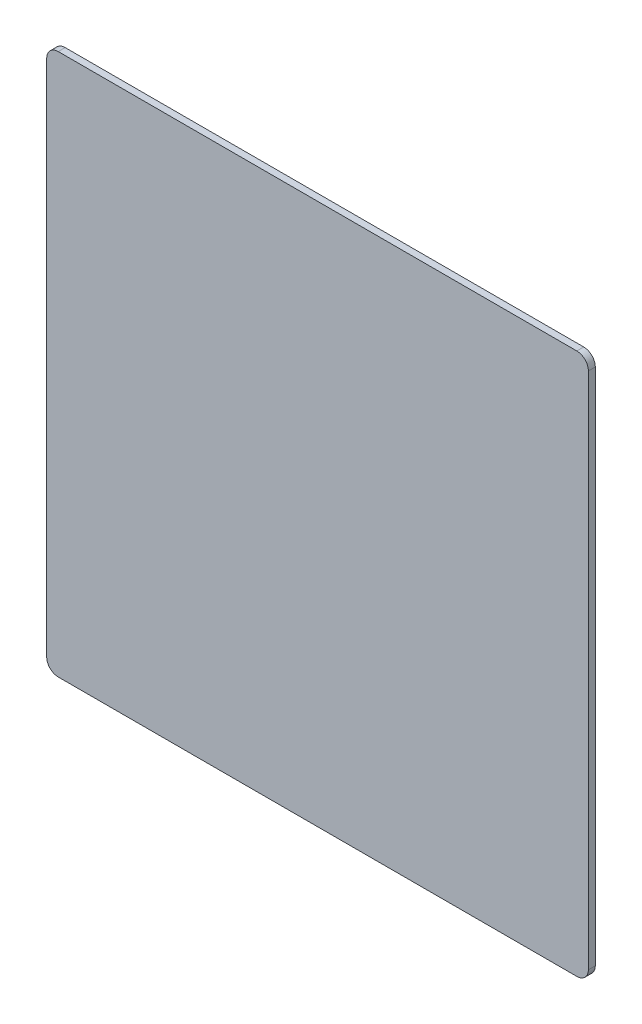
ISO-10303-21;
HEADER;
FILE_DESCRIPTION(('STEP AP214'),'2;1');
FILE_NAME('part.step','',(''),(''),'','','');
FILE_SCHEMA(('AUTOMOTIVE_DESIGN { 1 0 10303 214 1 1 1 1 }'));
ENDSEC;
DATA;
#1=APPLICATION_CONTEXT('core data for automotive mechanical design processes');
#2=APPLICATION_PROTOCOL_DEFINITION('international standard','automotive_design',2000,#1);
#3=PRODUCT_CONTEXT('',#1,'mechanical');
#4=PRODUCT('Part','Part','',(#3));
#5=PRODUCT_RELATED_PRODUCT_CATEGORY('part','',(#4));
#6=PRODUCT_DEFINITION_FORMATION('','',#4);
#7=PRODUCT_DEFINITION_CONTEXT('part definition',#1,'design');
#8=PRODUCT_DEFINITION('design','',#6,#7);
#9=PRODUCT_DEFINITION_SHAPE('','',#8);
#10=(LENGTH_UNIT() NAMED_UNIT(*) SI_UNIT(.MILLI.,.METRE.));
#11=(NAMED_UNIT(*) PLANE_ANGLE_UNIT() SI_UNIT($,.RADIAN.));
#12=(NAMED_UNIT(*) SI_UNIT($,.STERADIAN.) SOLID_ANGLE_UNIT());
#13=UNCERTAINTY_MEASURE_WITH_UNIT(LENGTH_MEASURE(1.E-05),#10,'distance_accuracy_value','');
#14=(GEOMETRIC_REPRESENTATION_CONTEXT(3) GLOBAL_UNCERTAINTY_ASSIGNED_CONTEXT((#13)) GLOBAL_UNIT_ASSIGNED_CONTEXT((#10,
#11,#12)) REPRESENTATION_CONTEXT('',''));
#15=CARTESIAN_POINT('',(0.,0.,0.));
#16=DIRECTION('',(0.,0.,1.));
#17=DIRECTION('',(1.,0.,0.));
#18=AXIS2_PLACEMENT_3D('',#15,#16,#17);
#19=CARTESIAN_POINT('',(-112.5,112.5,3.));
#20=DIRECTION('',(0.,0.,-1.));
#21=DIRECTION('',(-1.,0.,0.));
#22=AXIS2_PLACEMENT_3D('',#19,#20,#21);
#23=CYLINDRICAL_SURFACE('',#22,5.);
#24=CARTESIAN_POINT('',(-112.5,112.5,0.));
#25=DIRECTION('',(0.,0.,1.));
#26=DIRECTION('',(1.,0.,0.));
#27=AXIS2_PLACEMENT_3D('',#24,#25,#26);
#28=CIRCLE('',#27,5.);
#29=CARTESIAN_POINT('',(-112.5,117.5,0.));
#30=VERTEX_POINT('',#29);
#31=CARTESIAN_POINT('',(-117.5,112.5,0.));
#32=VERTEX_POINT('',#31);
#33=EDGE_CURVE('E133',#30,#32,#28,.T.);
#34=ORIENTED_EDGE('',*,*,#33,.T.);
#35=DIRECTION('',(0.,0.,-1.));
#36=VECTOR('',#35,1.);
#37=CARTESIAN_POINT('',(-117.5,112.5,3.));
#38=LINE('',#37,#36);
#39=CARTESIAN_POINT('',(-117.5,112.5,3.));
#40=VERTEX_POINT('',#39);
#41=EDGE_CURVE('E11',#40,#32,#38,.T.);
#42=ORIENTED_EDGE('',*,*,#41,.F.);
#43=CARTESIAN_POINT('',(-112.5,112.5,3.));
#44=DIRECTION('',(0.,0.,1.));
#45=DIRECTION('',(1.,0.,0.));
#46=AXIS2_PLACEMENT_3D('',#43,#44,#45);
#47=CIRCLE('',#46,5.);
#48=CARTESIAN_POINT('',(-112.5,117.5,3.));
#49=VERTEX_POINT('',#48);
#50=EDGE_CURVE('E147',#49,#40,#47,.T.);
#51=ORIENTED_EDGE('',*,*,#50,.F.);
#52=DIRECTION('',(0.,0.,-1.));
#53=VECTOR('',#52,1.);
#54=CARTESIAN_POINT('',(-112.5,117.5,3.));
#55=LINE('',#54,#53);
#56=EDGE_CURVE('E129',#49,#30,#55,.T.);
#57=ORIENTED_EDGE('',*,*,#56,.T.);
#58=EDGE_LOOP('',(#34,#42,#51,#57));
#59=FACE_BOUND('',#58,.T.);
#60=ADVANCED_FACE('F37',(#59),#23,.T.);
#61=CARTESIAN_POINT('',(-117.5,112.5,3.));
#62=DIRECTION('',(1.,0.,0.));
#63=DIRECTION('',(0.,0.,-1.));
#64=AXIS2_PLACEMENT_3D('',#61,#62,#63);
#65=PLANE('',#64);
#66=DIRECTION('',(0.,-1.,0.));
#67=VECTOR('',#66,1.);
#68=CARTESIAN_POINT('',(-117.5,112.5,0.));
#69=LINE('',#68,#67);
#70=CARTESIAN_POINT('',(-117.5,-112.5,0.));
#71=VERTEX_POINT('',#70);
#72=EDGE_CURVE('E136',#32,#71,#69,.T.);
#73=ORIENTED_EDGE('',*,*,#72,.T.);
#74=DIRECTION('',(0.,0.,-1.));
#75=VECTOR('',#74,1.);
#76=CARTESIAN_POINT('',(-117.5,-112.5,3.));
#77=LINE('',#76,#75);
#78=CARTESIAN_POINT('',(-117.5,-112.5,3.));
#79=VERTEX_POINT('',#78);
#80=EDGE_CURVE('E45',#79,#71,#77,.T.);
#81=ORIENTED_EDGE('',*,*,#80,.F.);
#82=DIRECTION('',(0.,-1.,0.));
#83=VECTOR('',#82,1.);
#84=CARTESIAN_POINT('',(-117.5,112.5,3.));
#85=LINE('',#84,#83);
#86=EDGE_CURVE('E96',#40,#79,#85,.T.);
#87=ORIENTED_EDGE('',*,*,#86,.F.);
#88=ORIENTED_EDGE('',*,*,#41,.T.);
#89=EDGE_LOOP('',(#73,#81,#87,#88));
#90=FACE_BOUND('',#89,.T.);
#91=ADVANCED_FACE('F182',(#90),#65,.F.);
#92=CARTESIAN_POINT('',(-112.5,-112.5,3.));
#93=DIRECTION('',(0.,0.,-1.));
#94=DIRECTION('',(-1.,0.,0.));
#95=AXIS2_PLACEMENT_3D('',#92,#93,#94);
#96=CYLINDRICAL_SURFACE('',#95,5.);
#97=CARTESIAN_POINT('',(-112.5,-112.5,0.));
#98=DIRECTION('',(0.,0.,1.));
#99=DIRECTION('',(1.,0.,0.));
#100=AXIS2_PLACEMENT_3D('',#97,#98,#99);
#101=CIRCLE('',#100,5.);
#102=CARTESIAN_POINT('',(-112.5,-117.5,0.));
#103=VERTEX_POINT('',#102);
#104=EDGE_CURVE('E138',#71,#103,#101,.T.);
#105=ORIENTED_EDGE('',*,*,#104,.T.);
#106=DIRECTION('',(0.,0.,-1.));
#107=VECTOR('',#106,1.);
#108=CARTESIAN_POINT('',(-112.5,-117.5,3.));
#109=LINE('',#108,#107);
#110=CARTESIAN_POINT('',(-112.5,-117.5,3.));
#111=VERTEX_POINT('',#110);
#112=EDGE_CURVE('E154',#111,#103,#109,.T.);
#113=ORIENTED_EDGE('',*,*,#112,.F.);
#114=CARTESIAN_POINT('',(-112.5,-112.5,3.));
#115=DIRECTION('',(0.,0.,1.));
#116=DIRECTION('',(1.,0.,0.));
#117=AXIS2_PLACEMENT_3D('',#114,#115,#116);
#118=CIRCLE('',#117,5.);
#119=EDGE_CURVE('E162',#79,#111,#118,.T.);
#120=ORIENTED_EDGE('',*,*,#119,.F.);
#121=ORIENTED_EDGE('',*,*,#80,.T.);
#122=EDGE_LOOP('',(#105,#113,#120,#121));
#123=FACE_BOUND('',#122,.T.);
#124=ADVANCED_FACE('F160',(#123),#96,.T.);
#125=CARTESIAN_POINT('',(-112.5,-117.5,3.));
#126=DIRECTION('',(0.,1.,0.));
#127=DIRECTION('',(-1.,0.,0.));
#128=AXIS2_PLACEMENT_3D('',#125,#126,#127);
#129=PLANE('',#128);
#130=DIRECTION('',(1.,0.,0.));
#131=VECTOR('',#130,1.);
#132=CARTESIAN_POINT('',(-112.5,-117.5,0.));
#133=LINE('',#132,#131);
#134=CARTESIAN_POINT('',(112.5,-117.5,0.));
#135=VERTEX_POINT('',#134);
#136=EDGE_CURVE('E140',#103,#135,#133,.T.);
#137=ORIENTED_EDGE('',*,*,#136,.T.);
#138=DIRECTION('',(0.,0.,-1.));
#139=VECTOR('',#138,1.);
#140=CARTESIAN_POINT('',(112.5,-117.5,3.));
#141=LINE('',#140,#139);
#142=CARTESIAN_POINT('',(112.5,-117.5,3.));
#143=VERTEX_POINT('',#142);
#144=EDGE_CURVE('E151',#143,#135,#141,.T.);
#145=ORIENTED_EDGE('',*,*,#144,.F.);
#146=DIRECTION('',(1.,0.,0.));
#147=VECTOR('',#146,1.);
#148=CARTESIAN_POINT('',(-112.5,-117.5,3.));
#149=LINE('',#148,#147);
#150=EDGE_CURVE('E174',#111,#143,#149,.T.);
#151=ORIENTED_EDGE('',*,*,#150,.F.);
#152=ORIENTED_EDGE('',*,*,#112,.T.);
#153=EDGE_LOOP('',(#137,#145,#151,#152));
#154=FACE_BOUND('',#153,.T.);
#155=ADVANCED_FACE('F170',(#154),#129,.F.);
#156=CARTESIAN_POINT('',(112.5,-112.5,3.));
#157=DIRECTION('',(0.,0.,-1.));
#158=DIRECTION('',(-1.,0.,0.));
#159=AXIS2_PLACEMENT_3D('',#156,#157,#158);
#160=CYLINDRICAL_SURFACE('',#159,5.);
#161=CARTESIAN_POINT('',(112.5,-112.5,0.));
#162=DIRECTION('',(0.,0.,1.));
#163=DIRECTION('',(1.,0.,0.));
#164=AXIS2_PLACEMENT_3D('',#161,#162,#163);
#165=CIRCLE('',#164,5.);
#166=CARTESIAN_POINT('',(117.5,-112.5,0.));
#167=VERTEX_POINT('',#166);
#168=EDGE_CURVE('E142',#135,#167,#165,.T.);
#169=ORIENTED_EDGE('',*,*,#168,.T.);
#170=DIRECTION('',(0.,0.,-1.));
#171=VECTOR('',#170,1.);
#172=CARTESIAN_POINT('',(117.5,-112.5,3.));
#173=LINE('',#172,#171);
#174=CARTESIAN_POINT('',(117.5,-112.5,3.));
#175=VERTEX_POINT('',#174);
#176=EDGE_CURVE('E124',#175,#167,#173,.T.);
#177=ORIENTED_EDGE('',*,*,#176,.F.);
#178=CARTESIAN_POINT('',(112.5,-112.5,3.));
#179=DIRECTION('',(0.,0.,1.));
#180=DIRECTION('',(1.,0.,0.));
#181=AXIS2_PLACEMENT_3D('',#178,#179,#180);
#182=CIRCLE('',#181,5.);
#183=EDGE_CURVE('E115',#143,#175,#182,.T.);
#184=ORIENTED_EDGE('',*,*,#183,.F.);
#185=ORIENTED_EDGE('',*,*,#144,.T.);
#186=EDGE_LOOP('',(#169,#177,#184,#185));
#187=FACE_BOUND('',#186,.T.);
#188=ADVANCED_FACE('F173',(#187),#160,.T.);
#189=CARTESIAN_POINT('',(117.5,-112.5,3.));
#190=DIRECTION('',(-1.,0.,0.));
#191=DIRECTION('',(0.,0.,1.));
#192=AXIS2_PLACEMENT_3D('',#189,#190,#191);
#193=PLANE('',#192);
#194=DIRECTION('',(0.,1.,0.));
#195=VECTOR('',#194,1.);
#196=CARTESIAN_POINT('',(117.5,-112.5,0.));
#197=LINE('',#196,#195);
#198=CARTESIAN_POINT('',(117.5,112.5,0.));
#199=VERTEX_POINT('',#198);
#200=EDGE_CURVE('E123',#167,#199,#197,.T.);
#201=ORIENTED_EDGE('',*,*,#200,.T.);
#202=DIRECTION('',(0.,0.,-1.));
#203=VECTOR('',#202,1.);
#204=CARTESIAN_POINT('',(117.5,112.5,3.));
#205=LINE('',#204,#203);
#206=CARTESIAN_POINT('',(117.5,112.5,3.));
#207=VERTEX_POINT('',#206);
#208=EDGE_CURVE('E120',#207,#199,#205,.T.);
#209=ORIENTED_EDGE('',*,*,#208,.F.);
#210=DIRECTION('',(0.,1.,0.));
#211=VECTOR('',#210,1.);
#212=CARTESIAN_POINT('',(117.5,-112.5,3.));
#213=LINE('',#212,#211);
#214=EDGE_CURVE('E109',#175,#207,#213,.T.);
#215=ORIENTED_EDGE('',*,*,#214,.F.);
#216=ORIENTED_EDGE('',*,*,#176,.T.);
#217=EDGE_LOOP('',(#201,#209,#215,#216));
#218=FACE_BOUND('',#217,.T.);
#219=ADVANCED_FACE('F121',(#218),#193,.F.);
#220=CARTESIAN_POINT('',(112.5,112.5,3.));
#221=DIRECTION('',(0.,0.,-1.));
#222=DIRECTION('',(-1.,0.,0.));
#223=AXIS2_PLACEMENT_3D('',#220,#221,#222);
#224=CYLINDRICAL_SURFACE('',#223,5.);
#225=CARTESIAN_POINT('',(112.5,112.5,0.));
#226=DIRECTION('',(0.,0.,1.));
#227=DIRECTION('',(1.,0.,0.));
#228=AXIS2_PLACEMENT_3D('',#225,#226,#227);
#229=CIRCLE('',#228,5.);
#230=CARTESIAN_POINT('',(112.5,117.5,0.));
#231=VERTEX_POINT('',#230);
#232=EDGE_CURVE('E82',#199,#231,#229,.T.);
#233=ORIENTED_EDGE('',*,*,#232,.T.);
#234=DIRECTION('',(0.,0.,-1.));
#235=VECTOR('',#234,1.);
#236=CARTESIAN_POINT('',(112.5,117.5,3.));
#237=LINE('',#236,#235);
#238=CARTESIAN_POINT('',(112.5,117.5,3.));
#239=VERTEX_POINT('',#238);
#240=EDGE_CURVE('E125',#239,#231,#237,.T.);
#241=ORIENTED_EDGE('',*,*,#240,.F.);
#242=CARTESIAN_POINT('',(112.5,112.5,3.));
#243=DIRECTION('',(0.,0.,1.));
#244=DIRECTION('',(1.,0.,0.));
#245=AXIS2_PLACEMENT_3D('',#242,#243,#244);
#246=CIRCLE('',#245,5.);
#247=EDGE_CURVE('E113',#207,#239,#246,.T.);
#248=ORIENTED_EDGE('',*,*,#247,.F.);
#249=ORIENTED_EDGE('',*,*,#208,.T.);
#250=EDGE_LOOP('',(#233,#241,#248,#249));
#251=FACE_BOUND('',#250,.T.);
#252=ADVANCED_FACE('F127',(#251),#224,.T.);
#253=CARTESIAN_POINT('',(112.5,117.5,3.));
#254=DIRECTION('',(0.,-1.,0.));
#255=DIRECTION('',(1.,0.,0.));
#256=AXIS2_PLACEMENT_3D('',#253,#254,#255);
#257=PLANE('',#256);
#258=DIRECTION('',(-1.,0.,0.));
#259=VECTOR('',#258,1.);
#260=CARTESIAN_POINT('',(112.5,117.5,0.));
#261=LINE('',#260,#259);
#262=EDGE_CURVE('E88',#231,#30,#261,.T.);
#263=ORIENTED_EDGE('',*,*,#262,.T.);
#264=ORIENTED_EDGE('',*,*,#56,.F.);
#265=DIRECTION('',(-1.,0.,0.));
#266=VECTOR('',#265,1.);
#267=CARTESIAN_POINT('',(112.5,117.5,3.));
#268=LINE('',#267,#266);
#269=EDGE_CURVE('E53',#239,#49,#268,.T.);
#270=ORIENTED_EDGE('',*,*,#269,.F.);
#271=ORIENTED_EDGE('',*,*,#240,.T.);
#272=EDGE_LOOP('',(#263,#264,#270,#271));
#273=FACE_BOUND('',#272,.T.);
#274=ADVANCED_FACE('F198',(#273),#257,.F.);
#275=CARTESIAN_POINT('',(-112.5,112.5,3.));
#276=DIRECTION('',(0.,0.,1.));
#277=DIRECTION('',(1.,0.,0.));
#278=AXIS2_PLACEMENT_3D('',#275,#276,#277);
#279=PLANE('',#278);
#280=ORIENTED_EDGE('',*,*,#50,.T.);
#281=ORIENTED_EDGE('',*,*,#86,.T.);
#282=ORIENTED_EDGE('',*,*,#119,.T.);
#283=ORIENTED_EDGE('',*,*,#150,.T.);
#284=ORIENTED_EDGE('',*,*,#183,.T.);
#285=ORIENTED_EDGE('',*,*,#214,.T.);
#286=ORIENTED_EDGE('',*,*,#247,.T.);
#287=ORIENTED_EDGE('',*,*,#269,.T.);
#288=EDGE_LOOP('',(#280,#281,#282,#283,#284,#285,#286,#287));
#289=FACE_BOUND('',#288,.T.);
#290=ADVANCED_FACE('F111',(#289),#279,.T.);
#291=CARTESIAN_POINT('',(-112.5,112.5,0.));
#292=DIRECTION('',(0.,0.,1.));
#293=DIRECTION('',(1.,0.,0.));
#294=AXIS2_PLACEMENT_3D('',#291,#292,#293);
#295=PLANE('',#294);
#296=ORIENTED_EDGE('',*,*,#33,.F.);
#297=ORIENTED_EDGE('',*,*,#262,.F.);
#298=ORIENTED_EDGE('',*,*,#232,.F.);
#299=ORIENTED_EDGE('',*,*,#200,.F.);
#300=ORIENTED_EDGE('',*,*,#168,.F.);
#301=ORIENTED_EDGE('',*,*,#136,.F.);
#302=ORIENTED_EDGE('',*,*,#104,.F.);
#303=ORIENTED_EDGE('',*,*,#72,.F.);
#304=EDGE_LOOP('',(#296,#297,#298,#299,#300,#301,#302,#303));
#305=FACE_BOUND('',#304,.T.);
#306=ADVANCED_FACE('F166',(#305),#295,.F.);
#307=CLOSED_SHELL('',(#60,#91,#124,#155,#188,#219,#252,#274,#290,#306));
#308=MANIFOLD_SOLID_BREP('B2',#307);
#309=ADVANCED_BREP_SHAPE_REPRESENTATION('',(#18,#308),#14);
#310=SHAPE_DEFINITION_REPRESENTATION(#9,#309);
ENDSEC;
END-ISO-10303-21;
